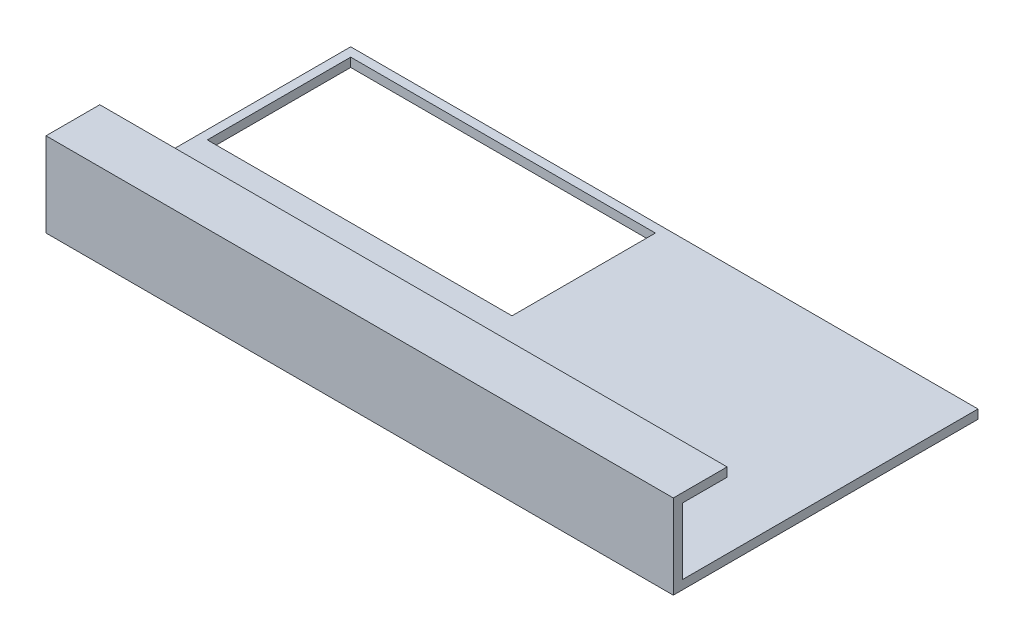
ISO-10303-21;
HEADER;
FILE_DESCRIPTION(('STEP AP214'),'2;1');
FILE_NAME('part.step','',(''),(''),'','','');
FILE_SCHEMA(('AUTOMOTIVE_DESIGN { 1 0 10303 214 1 1 1 1 }'));
ENDSEC;
DATA;
#1=APPLICATION_CONTEXT('core data for automotive mechanical design processes');
#2=APPLICATION_PROTOCOL_DEFINITION('international standard','automotive_design',2000,#1);
#3=PRODUCT_CONTEXT('',#1,'mechanical');
#4=PRODUCT('Part','Part','',(#3));
#5=PRODUCT_RELATED_PRODUCT_CATEGORY('part','',(#4));
#6=PRODUCT_DEFINITION_FORMATION('','',#4);
#7=PRODUCT_DEFINITION_CONTEXT('part definition',#1,'design');
#8=PRODUCT_DEFINITION('design','',#6,#7);
#9=PRODUCT_DEFINITION_SHAPE('','',#8);
#10=(LENGTH_UNIT() NAMED_UNIT(*) SI_UNIT(.MILLI.,.METRE.));
#11=(NAMED_UNIT(*) PLANE_ANGLE_UNIT() SI_UNIT($,.RADIAN.));
#12=(NAMED_UNIT(*) SI_UNIT($,.STERADIAN.) SOLID_ANGLE_UNIT());
#13=UNCERTAINTY_MEASURE_WITH_UNIT(LENGTH_MEASURE(1.E-05),#10,'distance_accuracy_value','');
#14=(GEOMETRIC_REPRESENTATION_CONTEXT(3) GLOBAL_UNCERTAINTY_ASSIGNED_CONTEXT((#13)) GLOBAL_UNIT_ASSIGNED_CONTEXT((#10,
#11,#12)) REPRESENTATION_CONTEXT('',''));
#15=CARTESIAN_POINT('',(0.,0.,0.));
#16=DIRECTION('',(0.,0.,1.));
#17=DIRECTION('',(1.,0.,0.));
#18=AXIS2_PLACEMENT_3D('',#15,#16,#17);
#19=CARTESIAN_POINT('',(0.,2.5,0.));
#20=DIRECTION('',(0.,-1.,0.));
#21=DIRECTION('',(0.,0.,-1.));
#22=AXIS2_PLACEMENT_3D('',#19,#20,#21);
#23=PLANE('',#22);
#24=DIRECTION('',(-1.,0.,0.));
#25=VECTOR('',#24,1.);
#26=CARTESIAN_POINT('',(0.,2.5,-40.));
#27=LINE('',#26,#25);
#28=CARTESIAN_POINT('',(0.,2.5,-40.));
#29=VERTEX_POINT('',#28);
#30=CARTESIAN_POINT('',(-85.,2.5,-40.));
#31=VERTEX_POINT('',#30);
#32=EDGE_CURVE('E200',#29,#31,#27,.T.);
#33=ORIENTED_EDGE('',*,*,#32,.F.);
#34=DIRECTION('',(0.,0.,-1.));
#35=VECTOR('',#34,1.);
#36=CARTESIAN_POINT('',(0.,2.5,-40.));
#37=LINE('',#36,#35);
#38=CARTESIAN_POINT('',(0.,2.5,0.));
#39=VERTEX_POINT('',#38);
#40=EDGE_CURVE('E204',#39,#29,#37,.T.);
#41=ORIENTED_EDGE('',*,*,#40,.F.);
#42=DIRECTION('',(1.,0.,0.));
#43=VECTOR('',#42,1.);
#44=CARTESIAN_POINT('',(-85.,2.5,0.));
#45=LINE('',#44,#43);
#46=CARTESIAN_POINT('',(-85.,2.5,0.));
#47=VERTEX_POINT('',#46);
#48=EDGE_CURVE('E207',#47,#39,#45,.T.);
#49=ORIENTED_EDGE('',*,*,#48,.F.);
#50=DIRECTION('',(0.,0.,1.));
#51=VECTOR('',#50,1.);
#52=CARTESIAN_POINT('',(-85.,2.5,0.));
#53=LINE('',#52,#51);
#54=EDGE_CURVE('E197',#31,#47,#53,.T.);
#55=ORIENTED_EDGE('',*,*,#54,.F.);
#56=EDGE_LOOP('',(#33,#41,#49,#55));
#57=FACE_BOUND('',#56,.T.);
#58=DIRECTION('',(-1.,0.,0.));
#59=VECTOR('',#58,1.);
#60=CARTESIAN_POINT('',(-87.5,2.5,40.));
#61=LINE('',#60,#59);
#62=CARTESIAN_POINT('',(87.5,2.5,40.));
#63=VERTEX_POINT('',#62);
#64=CARTESIAN_POINT('',(-87.5,2.5,40.));
#65=VERTEX_POINT('',#64);
#66=EDGE_CURVE('E57',#63,#65,#61,.T.);
#67=ORIENTED_EDGE('',*,*,#66,.F.);
#68=DIRECTION('',(0.,0.,-1.));
#69=VECTOR('',#68,1.);
#70=CARTESIAN_POINT('',(87.5,2.5,42.5));
#71=LINE('',#70,#69);
#72=CARTESIAN_POINT('',(87.5,2.5,-42.5));
#73=VERTEX_POINT('',#72);
#74=EDGE_CURVE('E235',#63,#73,#71,.T.);
#75=ORIENTED_EDGE('',*,*,#74,.T.);
#76=DIRECTION('',(-1.,0.,0.));
#77=VECTOR('',#76,1.);
#78=CARTESIAN_POINT('',(-87.5,2.5,-42.5));
#79=LINE('',#78,#77);
#80=CARTESIAN_POINT('',(-87.5,2.5,-42.5));
#81=VERTEX_POINT('',#80);
#82=EDGE_CURVE('E238',#73,#81,#79,.T.);
#83=ORIENTED_EDGE('',*,*,#82,.T.);
#84=DIRECTION('',(0.,0.,1.));
#85=VECTOR('',#84,1.);
#86=CARTESIAN_POINT('',(-87.5,2.5,42.5));
#87=LINE('',#86,#85);
#88=EDGE_CURVE('E242',#81,#65,#87,.T.);
#89=ORIENTED_EDGE('',*,*,#88,.T.);
#90=EDGE_LOOP('',(#67,#75,#83,#89));
#91=FACE_BOUND('',#90,.T.);
#92=ADVANCED_FACE('F41',(#57,#91),#23,.F.);
#93=CARTESIAN_POINT('',(87.5,2.5,42.5));
#94=DIRECTION('',(-1.,0.,0.));
#95=DIRECTION('',(0.,0.,1.));
#96=AXIS2_PLACEMENT_3D('',#93,#94,#95);
#97=PLANE('',#96);
#98=DIRECTION('',(0.,0.,-1.));
#99=VECTOR('',#98,1.);
#100=CARTESIAN_POINT('',(87.5,0.,42.5));
#101=LINE('',#100,#99);
#102=CARTESIAN_POINT('',(87.5,0.,42.5));
#103=VERTEX_POINT('',#102);
#104=CARTESIAN_POINT('',(87.5,0.,-42.5));
#105=VERTEX_POINT('',#104);
#106=EDGE_CURVE('E234',#103,#105,#101,.T.);
#107=ORIENTED_EDGE('',*,*,#106,.T.);
#108=DIRECTION('',(0.,-1.,0.));
#109=VECTOR('',#108,1.);
#110=CARTESIAN_POINT('',(87.5,2.5,-42.5));
#111=LINE('',#110,#109);
#112=EDGE_CURVE('E11',#73,#105,#111,.T.);
#113=ORIENTED_EDGE('',*,*,#112,.F.);
#114=ORIENTED_EDGE('',*,*,#74,.F.);
#115=DIRECTION('',(0.,-1.,0.));
#116=VECTOR('',#115,1.);
#117=CARTESIAN_POINT('',(87.5,21.,40.));
#118=LINE('',#117,#116);
#119=CARTESIAN_POINT('',(87.5,21.,40.));
#120=VERTEX_POINT('',#119);
#121=EDGE_CURVE('E192',#120,#63,#118,.T.);
#122=ORIENTED_EDGE('',*,*,#121,.F.);
#123=DIRECTION('',(0.,0.,-1.));
#124=VECTOR('',#123,1.);
#125=CARTESIAN_POINT('',(87.5,21.,42.5));
#126=LINE('',#125,#124);
#127=CARTESIAN_POINT('',(87.5,21.,27.4950203007756));
#128=VERTEX_POINT('',#127);
#129=EDGE_CURVE('E162',#120,#128,#126,.T.);
#130=ORIENTED_EDGE('',*,*,#129,.T.);
#131=DIRECTION('',(0.,-1.,0.));
#132=VECTOR('',#131,1.);
#133=CARTESIAN_POINT('',(87.5,23.5,27.4950203007756));
#134=LINE('',#133,#132);
#135=CARTESIAN_POINT('',(87.5,23.5,27.4950203007756));
#136=VERTEX_POINT('',#135);
#137=EDGE_CURVE('E178',#136,#128,#134,.T.);
#138=ORIENTED_EDGE('',*,*,#137,.F.);
#139=DIRECTION('',(0.,0.,-1.));
#140=VECTOR('',#139,1.);
#141=CARTESIAN_POINT('',(87.5,23.5,42.5));
#142=LINE('',#141,#140);
#143=CARTESIAN_POINT('',(87.5,23.5,42.5));
#144=VERTEX_POINT('',#143);
#145=EDGE_CURVE('E152',#144,#136,#142,.T.);
#146=ORIENTED_EDGE('',*,*,#145,.F.);
#147=DIRECTION('',(0.,-1.,0.));
#148=VECTOR('',#147,1.);
#149=CARTESIAN_POINT('',(87.5,2.5,42.5));
#150=LINE('',#149,#148);
#151=EDGE_CURVE('E143',#144,#103,#150,.T.);
#152=ORIENTED_EDGE('',*,*,#151,.T.);
#153=EDGE_LOOP('',(#107,#113,#114,#122,#130,#138,#146,#152));
#154=FACE_BOUND('',#153,.T.);
#155=ADVANCED_FACE('F43',(#154),#97,.F.);
#156=CARTESIAN_POINT('',(-87.5,2.5,-42.5));
#157=DIRECTION('',(0.,0.,1.));
#158=DIRECTION('',(1.,0.,0.));
#159=AXIS2_PLACEMENT_3D('',#156,#157,#158);
#160=PLANE('',#159);
#161=DIRECTION('',(-1.,0.,0.));
#162=VECTOR('',#161,1.);
#163=CARTESIAN_POINT('',(-87.5,0.,-42.5));
#164=LINE('',#163,#162);
#165=CARTESIAN_POINT('',(-87.5,0.,-42.5));
#166=VERTEX_POINT('',#165);
#167=EDGE_CURVE('E248',#105,#166,#164,.T.);
#168=ORIENTED_EDGE('',*,*,#167,.T.);
#169=DIRECTION('',(0.,-1.,0.));
#170=VECTOR('',#169,1.);
#171=CARTESIAN_POINT('',(-87.5,2.5,-42.5));
#172=LINE('',#171,#170);
#173=EDGE_CURVE('E50',#81,#166,#172,.T.);
#174=ORIENTED_EDGE('',*,*,#173,.F.);
#175=ORIENTED_EDGE('',*,*,#82,.F.);
#176=ORIENTED_EDGE('',*,*,#112,.T.);
#177=EDGE_LOOP('',(#168,#174,#175,#176));
#178=FACE_BOUND('',#177,.T.);
#179=ADVANCED_FACE('F277',(#178),#160,.F.);
#180=CARTESIAN_POINT('',(-87.5,2.5,42.5));
#181=DIRECTION('',(1.,0.,0.));
#182=DIRECTION('',(0.,0.,-1.));
#183=AXIS2_PLACEMENT_3D('',#180,#181,#182);
#184=PLANE('',#183);
#185=DIRECTION('',(0.,0.,1.));
#186=VECTOR('',#185,1.);
#187=CARTESIAN_POINT('',(-87.5,0.,42.5));
#188=LINE('',#187,#186);
#189=CARTESIAN_POINT('',(-87.5,0.,42.5));
#190=VERTEX_POINT('',#189);
#191=EDGE_CURVE('E139',#166,#190,#188,.T.);
#192=ORIENTED_EDGE('',*,*,#191,.T.);
#193=DIRECTION('',(0.,-1.,0.));
#194=VECTOR('',#193,1.);
#195=CARTESIAN_POINT('',(-87.5,2.5,42.5));
#196=LINE('',#195,#194);
#197=CARTESIAN_POINT('',(-87.5,23.5,42.5));
#198=VERTEX_POINT('',#197);
#199=EDGE_CURVE('E131',#198,#190,#196,.T.);
#200=ORIENTED_EDGE('',*,*,#199,.F.);
#201=DIRECTION('',(0.,0.,1.));
#202=VECTOR('',#201,1.);
#203=CARTESIAN_POINT('',(-87.5,23.5,42.5));
#204=LINE('',#203,#202);
#205=CARTESIAN_POINT('',(-87.5,23.5,27.4950203007756));
#206=VERTEX_POINT('',#205);
#207=EDGE_CURVE('E136',#206,#198,#204,.T.);
#208=ORIENTED_EDGE('',*,*,#207,.F.);
#209=DIRECTION('',(0.,-1.,0.));
#210=VECTOR('',#209,1.);
#211=CARTESIAN_POINT('',(-87.5,23.5,27.4950203007756));
#212=LINE('',#211,#210);
#213=CARTESIAN_POINT('',(-87.5,21.,27.4950203007756));
#214=VERTEX_POINT('',#213);
#215=EDGE_CURVE('E169',#206,#214,#212,.T.);
#216=ORIENTED_EDGE('',*,*,#215,.T.);
#217=DIRECTION('',(0.,0.,1.));
#218=VECTOR('',#217,1.);
#219=CARTESIAN_POINT('',(-87.5,21.,42.5));
#220=LINE('',#219,#218);
#221=CARTESIAN_POINT('',(-87.5,21.,40.));
#222=VERTEX_POINT('',#221);
#223=EDGE_CURVE('E170',#214,#222,#220,.T.);
#224=ORIENTED_EDGE('',*,*,#223,.T.);
#225=DIRECTION('',(0.,-1.,0.));
#226=VECTOR('',#225,1.);
#227=CARTESIAN_POINT('',(-87.5,21.,40.));
#228=LINE('',#227,#226);
#229=EDGE_CURVE('E186',#222,#65,#228,.T.);
#230=ORIENTED_EDGE('',*,*,#229,.T.);
#231=ORIENTED_EDGE('',*,*,#88,.F.);
#232=ORIENTED_EDGE('',*,*,#173,.T.);
#233=EDGE_LOOP('',(#192,#200,#208,#216,#224,#230,#231,#232));
#234=FACE_BOUND('',#233,.T.);
#235=ADVANCED_FACE('F133',(#234),#184,.F.);
#236=CARTESIAN_POINT('',(-87.5,2.5,42.5));
#237=DIRECTION('',(0.,0.,-1.));
#238=DIRECTION('',(-1.,0.,0.));
#239=AXIS2_PLACEMENT_3D('',#236,#237,#238);
#240=PLANE('',#239);
#241=DIRECTION('',(1.,0.,0.));
#242=VECTOR('',#241,1.);
#243=CARTESIAN_POINT('',(-87.5,0.,42.5));
#244=LINE('',#243,#242);
#245=EDGE_CURVE('E239',#190,#103,#244,.T.);
#246=ORIENTED_EDGE('',*,*,#245,.T.);
#247=ORIENTED_EDGE('',*,*,#151,.F.);
#248=DIRECTION('',(1.,0.,0.));
#249=VECTOR('',#248,1.);
#250=CARTESIAN_POINT('',(-87.5,23.5,42.5));
#251=LINE('',#250,#249);
#252=EDGE_CURVE('E146',#198,#144,#251,.T.);
#253=ORIENTED_EDGE('',*,*,#252,.F.);
#254=ORIENTED_EDGE('',*,*,#199,.T.);
#255=EDGE_LOOP('',(#246,#247,#253,#254));
#256=FACE_BOUND('',#255,.T.);
#257=ADVANCED_FACE('F147',(#256),#240,.F.);
#258=CARTESIAN_POINT('',(0.,0.,0.));
#259=DIRECTION('',(0.,-1.,0.));
#260=DIRECTION('',(0.,0.,-1.));
#261=AXIS2_PLACEMENT_3D('',#258,#259,#260);
#262=PLANE('',#261);
#263=DIRECTION('',(0.,0.,1.));
#264=VECTOR('',#263,1.);
#265=CARTESIAN_POINT('',(0.,0.,-40.));
#266=LINE('',#265,#264);
#267=CARTESIAN_POINT('',(0.,0.,-40.));
#268=VERTEX_POINT('',#267);
#269=CARTESIAN_POINT('',(0.,0.,0.));
#270=VERTEX_POINT('',#269);
#271=EDGE_CURVE('E196',#268,#270,#266,.T.);
#272=ORIENTED_EDGE('',*,*,#271,.F.);
#273=DIRECTION('',(1.,0.,0.));
#274=VECTOR('',#273,1.);
#275=CARTESIAN_POINT('',(0.,0.,-40.));
#276=LINE('',#275,#274);
#277=CARTESIAN_POINT('',(-85.,0.,-40.));
#278=VERTEX_POINT('',#277);
#279=EDGE_CURVE('E217',#278,#268,#276,.T.);
#280=ORIENTED_EDGE('',*,*,#279,.F.);
#281=DIRECTION('',(0.,0.,-1.));
#282=VECTOR('',#281,1.);
#283=CARTESIAN_POINT('',(-85.,0.,0.));
#284=LINE('',#283,#282);
#285=CARTESIAN_POINT('',(-85.,0.,0.));
#286=VERTEX_POINT('',#285);
#287=EDGE_CURVE('E213',#286,#278,#284,.T.);
#288=ORIENTED_EDGE('',*,*,#287,.F.);
#289=DIRECTION('',(-1.,0.,0.));
#290=VECTOR('',#289,1.);
#291=CARTESIAN_POINT('',(-85.,0.,0.));
#292=LINE('',#291,#290);
#293=EDGE_CURVE('E210',#270,#286,#292,.T.);
#294=ORIENTED_EDGE('',*,*,#293,.F.);
#295=EDGE_LOOP('',(#272,#280,#288,#294));
#296=FACE_BOUND('',#295,.T.);
#297=ORIENTED_EDGE('',*,*,#106,.F.);
#298=ORIENTED_EDGE('',*,*,#245,.F.);
#299=ORIENTED_EDGE('',*,*,#191,.F.);
#300=ORIENTED_EDGE('',*,*,#167,.F.);
#301=EDGE_LOOP('',(#297,#298,#299,#300));
#302=FACE_BOUND('',#301,.T.);
#303=ADVANCED_FACE('F263',(#296,#302),#262,.T.);
#304=CARTESIAN_POINT('',(0.,96.4414711402797,-40.));
#305=DIRECTION('',(1.,0.,0.));
#306=DIRECTION('',(0.,0.,-1.));
#307=AXIS2_PLACEMENT_3D('',#304,#305,#306);
#308=PLANE('',#307);
#309=ORIENTED_EDGE('',*,*,#40,.T.);
#310=DIRECTION('',(0.,-1.,0.));
#311=VECTOR('',#310,1.);
#312=CARTESIAN_POINT('',(0.,96.4414711402797,-40.));
#313=LINE('',#312,#311);
#314=EDGE_CURVE('E201',#29,#268,#313,.T.);
#315=ORIENTED_EDGE('',*,*,#314,.T.);
#316=ORIENTED_EDGE('',*,*,#271,.T.);
#317=DIRECTION('',(0.,-1.,0.));
#318=VECTOR('',#317,1.);
#319=CARTESIAN_POINT('',(0.,96.4414711402797,0.));
#320=LINE('',#319,#318);
#321=EDGE_CURVE('E221',#39,#270,#320,.T.);
#322=ORIENTED_EDGE('',*,*,#321,.F.);
#323=EDGE_LOOP('',(#309,#315,#316,#322));
#324=FACE_BOUND('',#323,.T.);
#325=ADVANCED_FACE('F292',(#324),#308,.F.);
#326=CARTESIAN_POINT('',(0.,96.4414711402797,-40.));
#327=DIRECTION('',(0.,0.,-1.));
#328=DIRECTION('',(-1.,0.,0.));
#329=AXIS2_PLACEMENT_3D('',#326,#327,#328);
#330=PLANE('',#329);
#331=ORIENTED_EDGE('',*,*,#32,.T.);
#332=DIRECTION('',(0.,-1.,0.));
#333=VECTOR('',#332,1.);
#334=CARTESIAN_POINT('',(-85.,96.4414711402797,-40.));
#335=LINE('',#334,#333);
#336=EDGE_CURVE('E224',#31,#278,#335,.T.);
#337=ORIENTED_EDGE('',*,*,#336,.T.);
#338=ORIENTED_EDGE('',*,*,#279,.T.);
#339=ORIENTED_EDGE('',*,*,#314,.F.);
#340=EDGE_LOOP('',(#331,#337,#338,#339));
#341=FACE_BOUND('',#340,.T.);
#342=ADVANCED_FACE('F313',(#341),#330,.F.);
#343=CARTESIAN_POINT('',(-85.,96.4414711402797,0.));
#344=DIRECTION('',(-1.,0.,0.));
#345=DIRECTION('',(0.,0.,1.));
#346=AXIS2_PLACEMENT_3D('',#343,#344,#345);
#347=PLANE('',#346);
#348=ORIENTED_EDGE('',*,*,#54,.T.);
#349=DIRECTION('',(0.,-1.,0.));
#350=VECTOR('',#349,1.);
#351=CARTESIAN_POINT('',(-85.,96.4414711402797,0.));
#352=LINE('',#351,#350);
#353=EDGE_CURVE('E65',#47,#286,#352,.T.);
#354=ORIENTED_EDGE('',*,*,#353,.T.);
#355=ORIENTED_EDGE('',*,*,#287,.T.);
#356=ORIENTED_EDGE('',*,*,#336,.F.);
#357=EDGE_LOOP('',(#348,#354,#355,#356));
#358=FACE_BOUND('',#357,.T.);
#359=ADVANCED_FACE('F320',(#358),#347,.F.);
#360=CARTESIAN_POINT('',(-85.,96.4414711402797,0.));
#361=DIRECTION('',(0.,0.,1.));
#362=DIRECTION('',(1.,0.,0.));
#363=AXIS2_PLACEMENT_3D('',#360,#361,#362);
#364=PLANE('',#363);
#365=ORIENTED_EDGE('',*,*,#48,.T.);
#366=ORIENTED_EDGE('',*,*,#321,.T.);
#367=ORIENTED_EDGE('',*,*,#293,.T.);
#368=ORIENTED_EDGE('',*,*,#353,.F.);
#369=EDGE_LOOP('',(#365,#366,#367,#368));
#370=FACE_BOUND('',#369,.T.);
#371=ADVANCED_FACE('F328',(#370),#364,.F.);
#372=CARTESIAN_POINT('',(-87.5,21.,40.));
#373=DIRECTION('',(0.,0.,1.));
#374=DIRECTION('',(1.,0.,0.));
#375=AXIS2_PLACEMENT_3D('',#372,#373,#374);
#376=PLANE('',#375);
#377=ORIENTED_EDGE('',*,*,#66,.T.);
#378=ORIENTED_EDGE('',*,*,#229,.F.);
#379=DIRECTION('',(-1.,0.,0.));
#380=VECTOR('',#379,1.);
#381=CARTESIAN_POINT('',(-87.5,21.,40.));
#382=LINE('',#381,#380);
#383=EDGE_CURVE('E182',#120,#222,#382,.T.);
#384=ORIENTED_EDGE('',*,*,#383,.F.);
#385=ORIENTED_EDGE('',*,*,#121,.T.);
#386=EDGE_LOOP('',(#377,#378,#384,#385));
#387=FACE_BOUND('',#386,.T.);
#388=ADVANCED_FACE('F276',(#387),#376,.F.);
#389=CARTESIAN_POINT('',(-87.5,23.5,27.4950203007756));
#390=DIRECTION('',(0.,0.,1.));
#391=DIRECTION('',(1.,0.,0.));
#392=AXIS2_PLACEMENT_3D('',#389,#390,#391);
#393=PLANE('',#392);
#394=DIRECTION('',(-1.,0.,0.));
#395=VECTOR('',#394,1.);
#396=CARTESIAN_POINT('',(-87.5,21.,27.4950203007756));
#397=LINE('',#396,#395);
#398=EDGE_CURVE('E159',#128,#214,#397,.T.);
#399=ORIENTED_EDGE('',*,*,#398,.T.);
#400=ORIENTED_EDGE('',*,*,#215,.F.);
#401=DIRECTION('',(-1.,0.,0.));
#402=VECTOR('',#401,1.);
#403=CARTESIAN_POINT('',(-87.5,23.5,27.4950203007756));
#404=LINE('',#403,#402);
#405=EDGE_CURVE('E156',#136,#206,#404,.T.);
#406=ORIENTED_EDGE('',*,*,#405,.F.);
#407=ORIENTED_EDGE('',*,*,#137,.T.);
#408=EDGE_LOOP('',(#399,#400,#406,#407));
#409=FACE_BOUND('',#408,.T.);
#410=ADVANCED_FACE('F270',(#409),#393,.F.);
#411=CARTESIAN_POINT('',(0.,23.5,0.));
#412=DIRECTION('',(0.,-1.,0.));
#413=DIRECTION('',(0.,0.,-1.));
#414=AXIS2_PLACEMENT_3D('',#411,#412,#413);
#415=PLANE('',#414);
#416=ORIENTED_EDGE('',*,*,#207,.T.);
#417=ORIENTED_EDGE('',*,*,#252,.T.);
#418=ORIENTED_EDGE('',*,*,#145,.T.);
#419=ORIENTED_EDGE('',*,*,#405,.T.);
#420=EDGE_LOOP('',(#416,#417,#418,#419));
#421=FACE_BOUND('',#420,.T.);
#422=ADVANCED_FACE('F154',(#421),#415,.F.);
#423=CARTESIAN_POINT('',(0.,21.,0.));
#424=DIRECTION('',(0.,-1.,0.));
#425=DIRECTION('',(0.,0.,-1.));
#426=AXIS2_PLACEMENT_3D('',#423,#424,#425);
#427=PLANE('',#426);
#428=ORIENTED_EDGE('',*,*,#129,.F.);
#429=ORIENTED_EDGE('',*,*,#383,.T.);
#430=ORIENTED_EDGE('',*,*,#223,.F.);
#431=ORIENTED_EDGE('',*,*,#398,.F.);
#432=EDGE_LOOP('',(#428,#429,#430,#431));
#433=FACE_BOUND('',#432,.T.);
#434=ADVANCED_FACE('F273',(#433),#427,.T.);
#435=CLOSED_SHELL('',(#92,#155,#179,#235,#257,#303,#325,#342,#359,#371,#388,#410,#422,#434));
#436=MANIFOLD_SOLID_BREP('B2',#435);
#437=ADVANCED_BREP_SHAPE_REPRESENTATION('',(#18,#436),#14);
#438=SHAPE_DEFINITION_REPRESENTATION(#9,#437);
ENDSEC;
END-ISO-10303-21;
